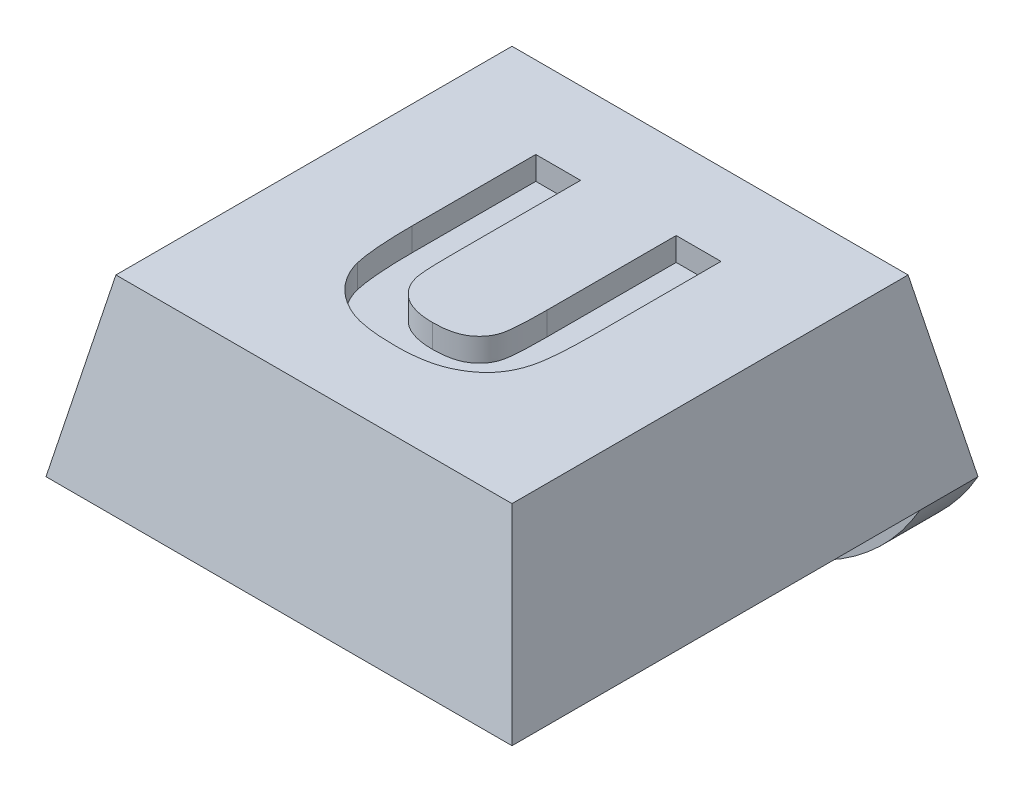
ISO-10303-21;
HEADER;
FILE_DESCRIPTION(('STEP AP214'),'2;1');
FILE_NAME('part.step','',(''),(''),'','','');
FILE_SCHEMA(('AUTOMOTIVE_DESIGN { 1 0 10303 214 1 1 1 1 }'));
ENDSEC;
DATA;
#1=APPLICATION_CONTEXT('core data for automotive mechanical design processes');
#2=APPLICATION_PROTOCOL_DEFINITION('international standard','automotive_design',2000,#1);
#3=PRODUCT_CONTEXT('',#1,'mechanical');
#4=PRODUCT('Part','Part','',(#3));
#5=PRODUCT_RELATED_PRODUCT_CATEGORY('part','',(#4));
#6=PRODUCT_DEFINITION_FORMATION('','',#4);
#7=PRODUCT_DEFINITION_CONTEXT('part definition',#1,'design');
#8=PRODUCT_DEFINITION('design','',#6,#7);
#9=PRODUCT_DEFINITION_SHAPE('','',#8);
#10=(LENGTH_UNIT() NAMED_UNIT(*) SI_UNIT(.MILLI.,.METRE.));
#11=(NAMED_UNIT(*) PLANE_ANGLE_UNIT() SI_UNIT($,.RADIAN.));
#12=(NAMED_UNIT(*) SI_UNIT($,.STERADIAN.) SOLID_ANGLE_UNIT());
#13=UNCERTAINTY_MEASURE_WITH_UNIT(LENGTH_MEASURE(1.E-05),#10,'distance_accuracy_value','');
#14=(GEOMETRIC_REPRESENTATION_CONTEXT(3) GLOBAL_UNCERTAINTY_ASSIGNED_CONTEXT((#13)) GLOBAL_UNIT_ASSIGNED_CONTEXT((#10,
#11,#12)) REPRESENTATION_CONTEXT('',''));
#15=CARTESIAN_POINT('',(0.,0.,0.));
#16=DIRECTION('',(0.,0.,1.));
#17=DIRECTION('',(1.,0.,0.));
#18=AXIS2_PLACEMENT_3D('',#15,#16,#17);
#19=CARTESIAN_POINT('',(0.,3.,0.));
#20=DIRECTION('',(0.,-1.,0.));
#21=DIRECTION('',(0.,0.,-1.));
#22=AXIS2_PLACEMENT_3D('',#19,#20,#21);
#23=PLANE('',#22);
#24=DIRECTION('',(-1.,0.,0.));
#25=VECTOR('',#24,1.);
#26=CARTESIAN_POINT('',(11.,3.,-0.6));
#27=LINE('',#26,#25);
#28=CARTESIAN_POINT('',(7.4,3.,-0.6));
#29=VERTEX_POINT('',#28);
#30=CARTESIAN_POINT('',(0.6,3.,-0.6));
#31=VERTEX_POINT('',#30);
#32=EDGE_CURVE('E229',#29,#31,#27,.T.);
#33=ORIENTED_EDGE('',*,*,#32,.F.);
#34=DIRECTION('',(0.,0.,1.));
#35=VECTOR('',#34,1.);
#36=CARTESIAN_POINT('',(7.4,3.,-8.));
#37=LINE('',#36,#35);
#38=CARTESIAN_POINT('',(7.4,3.,-7.4));
#39=VERTEX_POINT('',#38);
#40=EDGE_CURVE('E242',#39,#29,#37,.T.);
#41=ORIENTED_EDGE('',*,*,#40,.F.);
#42=DIRECTION('',(-1.,0.,0.));
#43=VECTOR('',#42,1.);
#44=CARTESIAN_POINT('',(11.,3.,-7.4));
#45=LINE('',#44,#43);
#46=CARTESIAN_POINT('',(0.599999999999999,3.,-7.4));
#47=VERTEX_POINT('',#46);
#48=EDGE_CURVE('E225',#39,#47,#45,.T.);
#49=ORIENTED_EDGE('',*,*,#48,.T.);
#50=DIRECTION('',(0.,0.,1.));
#51=VECTOR('',#50,1.);
#52=CARTESIAN_POINT('',(0.6,3.,-8.));
#53=LINE('',#52,#51);
#54=EDGE_CURVE('E245',#47,#31,#53,.T.);
#55=ORIENTED_EDGE('',*,*,#54,.T.);
#56=EDGE_LOOP('',(#33,#41,#49,#55));
#57=FACE_BOUND('',#56,.T.);
#58=DIRECTION('',(0.,0.,-1.));
#59=VECTOR('',#58,1.);
#60=CARTESIAN_POINT('',(2.41314026181107,3.,-3.87014547839466));
#61=LINE('',#60,#59);
#62=CARTESIAN_POINT('',(2.41314026181107,3.,-3.87014547839466));
#63=VERTEX_POINT('',#62);
#64=CARTESIAN_POINT('',(2.41314026181107,3.,-5.99514547839466));
#65=VERTEX_POINT('',#64);
#66=EDGE_CURVE('E58',#63,#65,#61,.T.);
#67=ORIENTED_EDGE('',*,*,#66,.T.);
#68=DIRECTION('',(1.,0.,0.));
#69=VECTOR('',#68,1.);
#70=CARTESIAN_POINT('',(2.41314026181107,3.,-5.99514547839466));
#71=LINE('',#70,#69);
#72=CARTESIAN_POINT('',(3.18237103104184,3.,-5.99514547839466));
#73=VERTEX_POINT('',#72);
#74=EDGE_CURVE('E197',#65,#73,#71,.T.);
#75=ORIENTED_EDGE('',*,*,#74,.T.);
#76=DIRECTION('',(0.,0.,1.));
#77=VECTOR('',#76,1.);
#78=CARTESIAN_POINT('',(3.18237103104184,3.,-5.99514547839466));
#79=LINE('',#78,#77);
#80=CARTESIAN_POINT('',(3.18237103104184,3.,-3.82447240147158));
#81=VERTEX_POINT('',#80);
#82=EDGE_CURVE('E695',#73,#81,#79,.T.);
#83=ORIENTED_EDGE('',*,*,#82,.T.);
#84=CARTESIAN_POINT('',(3.18237103104184,3.,-3.82447240147158));
#85=CARTESIAN_POINT('',(3.18266469492864,3.,-3.78333996841719));
#86=CARTESIAN_POINT('',(3.18322532716716,3.,-3.70481424885763));
#87=CARTESIAN_POINT('',(3.18361124176543,3.,-3.59262518044041));
#88=CARTESIAN_POINT('',(3.18574693972244,3.,-3.49189674937256));
#89=CARTESIAN_POINT('',(3.19037841056532,3.,-3.40246664659143));
#90=CARTESIAN_POINT('',(3.19355711693267,3.,-3.32438048014628));
#91=CARTESIAN_POINT('',(3.19945962920144,3.,-3.25762391832682));
#92=CARTESIAN_POINT('',(3.20534783647821,3.,-3.20222295906492));
#93=CARTESIAN_POINT('',(3.21107258842932,3.,-3.1692700104676));
#94=CARTESIAN_POINT('',(3.21362103104184,3.,-3.15460060659979));
#95=B_SPLINE_CURVE_WITH_KNOTS('',3,(#84,#85,#86,#87,#88,#89,#90,#91,#92,#93,#94),.UNSPECIFIED.,
.F.,.F.,(4,1,1,1,1,1,1,1,4),(0.,0.183825007060264,0.350939389686891,0.501381121480456,
0.634009924722662,0.75113916001217,0.85056330440193,0.933476446457445,1.),.UNSPECIFIED.);
#96=CARTESIAN_POINT('',(3.21362103104184,3.,-3.15460060659979));
#97=VERTEX_POINT('',#96);
#98=EDGE_CURVE('E690',#81,#97,#95,.T.);
#99=ORIENTED_EDGE('',*,*,#98,.T.);
#100=CARTESIAN_POINT('',(3.21362103104184,3.,-3.15460060659979));
#101=CARTESIAN_POINT('',(3.22412762778519,3.,-3.11505403752287));
#102=CARTESIAN_POINT('',(3.24481644323676,3.,-3.03718185023322));
#103=CARTESIAN_POINT('',(3.30184242677059,3.,-2.93073263742985));
#104=CARTESIAN_POINT('',(3.3771729457856,3.,-2.83690435982115));
#105=CARTESIAN_POINT('',(3.4540128524649,3.,-2.76998969413117));
#106=CARTESIAN_POINT('',(3.52352046730287,3.,-2.72263245904894));
#107=CARTESIAN_POINT('',(3.5825614906699,3.,-2.69381016306275));
#108=CARTESIAN_POINT('',(3.64520363108575,3.,-2.66753678693042));
#109=CARTESIAN_POINT('',(3.71277117624001,3.,-2.64737744766694));
#110=CARTESIAN_POINT('',(3.78453895067629,3.,-2.62973730085083));
#111=CARTESIAN_POINT('',(3.86137383334087,3.,-2.61953764416675));
#112=CARTESIAN_POINT('',(3.94262738294381,3.,-2.61170966141422));
#113=CARTESIAN_POINT('',(3.99832151695995,3.,-2.61093031444964));
#114=CARTESIAN_POINT('',(4.02692231309313,3.,-2.61053009377928));
#115=B_SPLINE_CURVE_WITH_KNOTS('',3,(#100,#101,#102,#103,#104,#105,#106,#107,#108,#109,#110,
#111,#112,#113,#114),.UNSPECIFIED.,.F.,.F.,(4,1,1,1,1,1,1,1,1,1,1,1,4),(0.,0.114743421271191,
0.225944282906219,0.336552611577656,0.451504771280934,0.511079547906043,0.572546352604732,
0.635866479310682,0.701907532163575,0.770586403165963,0.843449734748019,0.919606215265516,1.),.UNSPECIFIED.);
#116=CARTESIAN_POINT('',(4.02692231309313,3.,-2.61053009377928));
#117=VERTEX_POINT('',#116);
#118=EDGE_CURVE('E680',#97,#117,#115,.T.);
#119=ORIENTED_EDGE('',*,*,#118,.T.);
#120=CARTESIAN_POINT('',(4.02692231309313,3.,-2.61053009377928));
#121=CARTESIAN_POINT('',(4.05577738939585,3.,-2.61105343462313));
#122=CARTESIAN_POINT('',(4.11195763373269,3.,-2.61207236855943));
#123=CARTESIAN_POINT('',(4.19337239880035,3.,-2.618140475974));
#124=CARTESIAN_POINT('',(4.26933098261772,3.,-2.6295889026976));
#125=CARTESIAN_POINT('',(4.3397869186569,3.,-2.64460000101837));
#126=CARTESIAN_POINT('',(4.40511233006691,3.,-2.66357151356112));
#127=CARTESIAN_POINT('',(4.46478606122995,3.,-2.68759167847111));
#128=CARTESIAN_POINT('',(4.51871407488474,3.,-2.71649776940718));
#129=CARTESIAN_POINT('',(4.58207867780208,3.,-2.76006639104549));
#130=CARTESIAN_POINT('',(4.65025890781237,3.,-2.82152753804003));
#131=CARTESIAN_POINT('',(4.71587367402274,3.,-2.90509181849102));
#132=CARTESIAN_POINT('',(4.76283364949775,3.,-2.99733769361779));
#133=CARTESIAN_POINT('',(4.78485986819031,3.,-3.08156507740992));
#134=CARTESIAN_POINT('',(4.79618060478106,3.,-3.15494981075079));
#135=CARTESIAN_POINT('',(4.80307780638541,3.,-3.21916400061786));
#136=CARTESIAN_POINT('',(4.80938564586722,3.,-3.29183218243508));
#137=CARTESIAN_POINT('',(4.81511364662769,3.,-3.37275531916227));
#138=CARTESIAN_POINT('',(4.81903086457144,3.,-3.46199415311885));
#139=CARTESIAN_POINT('',(4.82114961918991,3.,-3.55977437520839));
#140=CARTESIAN_POINT('',(4.82281709018589,3.,-3.66608039145516));
#141=CARTESIAN_POINT('',(4.82319887283573,3.,-3.73980287784809));
#142=CARTESIAN_POINT('',(4.82339667206749,3.,-3.77799804249723));
#143=B_SPLINE_CURVE_WITH_KNOTS('',3,(#120,#121,#122,#123,#124,#125,#126,#127,#128,#129,#130,
#131,#132,#133,#134,#135,#136,#137,#138,#139,#140,#141,#142),.UNSPECIFIED.,.F.,.F.,(4,1,1,1,1,1,
1,1,1,1,1,1,1,1,1,1,1,1,1,1,4),(0.,0.0518438119306665,0.100938843171358,0.146542287812453,
0.189742133284701,0.230280246580349,0.268596217760667,0.30509323438548,0.33996418344798,
0.406554529976919,0.469135901134995,0.529866816686715,0.591101794550841,0.624629557038698,
0.663259733719709,0.707094516041552,0.755675646503373,0.808993028944534,0.86755245054543,
0.931379743056552,1.),.UNSPECIFIED.);
#144=CARTESIAN_POINT('',(4.82339667206749,3.,-3.77799804249723));
#145=VERTEX_POINT('',#144);
#146=EDGE_CURVE('E689',#117,#145,#143,.T.);
#147=ORIENTED_EDGE('',*,*,#146,.T.);
#148=DIRECTION('',(0.,0.,-1.));
#149=VECTOR('',#148,1.);
#150=CARTESIAN_POINT('',(4.82339667206749,3.,-3.77799804249723));
#151=LINE('',#150,#149);
#152=CARTESIAN_POINT('',(4.82339667206749,3.,-5.99514547839466));
#153=VERTEX_POINT('',#152);
#154=EDGE_CURVE('E716',#145,#153,#151,.T.);
#155=ORIENTED_EDGE('',*,*,#154,.T.);
#156=DIRECTION('',(1.,0.,0.));
#157=VECTOR('',#156,1.);
#158=CARTESIAN_POINT('',(4.82339667206749,3.,-5.99514547839466));
#159=LINE('',#158,#157);
#160=CARTESIAN_POINT('',(5.59262744129825,3.,-5.99514547839466));
#161=VERTEX_POINT('',#160);
#162=EDGE_CURVE('E723',#153,#161,#159,.T.);
#163=ORIENTED_EDGE('',*,*,#162,.T.);
#164=DIRECTION('',(0.,0.,1.));
#165=VECTOR('',#164,1.);
#166=CARTESIAN_POINT('',(5.59262744129825,3.,-5.99514547839466));
#167=LINE('',#166,#165);
#168=CARTESIAN_POINT('',(5.59262744129825,3.,-3.90299804249723));
#169=VERTEX_POINT('',#168);
#170=EDGE_CURVE('E727',#161,#169,#167,.T.);
#171=ORIENTED_EDGE('',*,*,#170,.T.);
#172=CARTESIAN_POINT('',(5.59262744129825,3.,-3.90299804249723));
#173=CARTESIAN_POINT('',(5.59252884740698,3.,-3.84530515735895));
#174=CARTESIAN_POINT('',(5.59233940195443,3.,-3.73444986407348));
#175=CARTESIAN_POINT('',(5.58938147465976,3.,-3.57495675504366));
#176=CARTESIAN_POINT('',(5.58309494056903,3.,-3.42862851389704));
#177=CARTESIAN_POINT('',(5.57783051076809,3.,-3.29521431202553));
#178=CARTESIAN_POINT('',(5.56767564210408,3.,-3.1750545028716));
#179=CARTESIAN_POINT('',(5.55704352929476,3.,-3.06807437577535));
#180=CARTESIAN_POINT('',(5.54334694702107,3.,-2.97429262707149));
#181=CARTESIAN_POINT('',(5.52381549319741,3.,-2.86769604126251));
#182=CARTESIAN_POINT('',(5.49099161499862,3.,-2.74810153051601));
#183=CARTESIAN_POINT('',(5.43809080901146,3.,-2.61599405575262));
#184=CARTESIAN_POINT('',(5.37048198877244,3.,-2.49580453247153));
#185=CARTESIAN_POINT('',(5.28843456199328,3.,-2.38707180572213));
#186=CARTESIAN_POINT('',(5.19242118774498,3.,-2.28936371421243));
#187=CARTESIAN_POINT('',(5.08100426899721,3.,-2.20306438137615));
#188=CARTESIAN_POINT('',(4.9553295008719,3.,-2.12712465052677));
#189=CARTESIAN_POINT('',(4.84016309009469,3.,-2.07244329887219));
#190=CARTESIAN_POINT('',(4.73975273479018,3.,-2.03562266860983));
#191=CARTESIAN_POINT('',(4.65797017955661,3.,-2.01070411598044));
#192=CARTESIAN_POINT('',(4.57044409312329,3.,-1.98995217493631));
#193=CARTESIAN_POINT('',(4.47727712811259,3.,-1.97348366403484));
#194=CARTESIAN_POINT('',(4.37842925153975,3.,-1.95959827304072));
#195=CARTESIAN_POINT('',(4.27386457386037,3.,-1.95032510694102));
#196=CARTESIAN_POINT('',(4.16374129146674,3.,-1.94453799725799));
#197=CARTESIAN_POINT('',(4.08862869941689,3.,-1.94409189838796));
#198=CARTESIAN_POINT('',(4.05015949258031,3.,-1.94386342711261));
#199=B_SPLINE_CURVE_WITH_KNOTS('',3,(#172,#173,#174,#175,#176,#177,#178,#179,#180,#181,#182,
#183,#184,#185,#186,#187,#188,#189,#190,#191,#192,#193,#194,#195,#196,#197,#198),.UNSPECIFIED.,
.F.,.F.,(4,1,1,1,1,1,1,1,1,1,1,1,1,1,1,1,1,1,1,1,1,1,1,1,4),(0.,0.0589822518665148,
0.113332776019573,0.163066996848931,0.208720820432053,0.249811139834418,0.286329176157329,
0.318613036661102,0.346676161329656,0.397089399385359,0.445108917572501,0.49181547303063,
0.537635583766378,0.583977529790645,0.631444968953473,0.681319919045405,0.733844646315688,
0.761490173539024,0.790600539422323,0.821199444835878,0.853389629847076,0.887295661622405,
0.923216688702173,0.960675127787456,1.),.UNSPECIFIED.);
#200=CARTESIAN_POINT('',(4.05015949258031,3.,-1.94386342711261));
#201=VERTEX_POINT('',#200);
#202=EDGE_CURVE('E731',#169,#201,#199,.T.);
#203=ORIENTED_EDGE('',*,*,#202,.T.);
#204=CARTESIAN_POINT('',(4.05015949258031,3.,-1.94386342711261));
#205=CARTESIAN_POINT('',(4.00394898952933,3.,-1.94445411740803));
#206=CARTESIAN_POINT('',(3.9144323565055,3.,-1.94559837256466));
#207=CARTESIAN_POINT('',(3.78449152160875,3.,-1.95070279676019));
#208=CARTESIAN_POINT('',(3.66341973054477,3.,-1.96123852335655));
#209=CARTESIAN_POINT('',(3.55083659828431,3.,-1.97547854435417));
#210=CARTESIAN_POINT('',(3.44678860813076,3.,-1.99378455697407));
#211=CARTESIAN_POINT('',(3.35101254315896,3.,-2.01566928059016));
#212=CARTESIAN_POINT('',(3.26427303539471,3.,-2.04332848315911));
#213=CARTESIAN_POINT('',(3.16095932069711,3.,-2.08283251168484));
#214=CARTESIAN_POINT('',(3.04579895158398,3.,-2.14326043214784));
#215=CARTESIAN_POINT('',(2.92044201771808,3.,-2.22387078646669));
#216=CARTESIAN_POINT('',(2.81040018703688,3.,-2.31485388374121));
#217=CARTESIAN_POINT('',(2.71664034282406,3.,-2.41532070508085));
#218=CARTESIAN_POINT('',(2.63826076225512,3.,-2.52174061827527));
#219=CARTESIAN_POINT('',(2.57455201153565,3.,-2.63181081387693));
#220=CARTESIAN_POINT('',(2.52349791577897,3.,-2.74369667159862));
#221=CARTESIAN_POINT('',(2.50216461629467,3.,-2.82145953251712));
#222=CARTESIAN_POINT('',(2.49166590283672,3.,-2.859728811728));
#223=B_SPLINE_CURVE_WITH_KNOTS('',3,(#204,#205,#206,#207,#208,#209,#210,#211,#212,#213,#214,
#215,#216,#217,#218,#219,#220,#221,#222),.UNSPECIFIED.,.F.,.F.,(4,1,1,1,1,1,1,1,1,1,1,1,1,1,1,1,
4),(0.,0.0705383458906597,0.136643291163387,0.198429902465619,0.25597418052394,
0.309794976232589,0.359633117755365,0.405792277216817,0.448642759284464,0.528318939757397,
0.603739881743586,0.675824581819638,0.745623938691081,0.812974235955689,0.877093332418524,
0.939514190668938,1.),.UNSPECIFIED.);
#224=CARTESIAN_POINT('',(2.49166590283672,3.,-2.859728811728));
#225=VERTEX_POINT('',#224);
#226=EDGE_CURVE('E737',#201,#225,#223,.T.);
#227=ORIENTED_EDGE('',*,*,#226,.T.);
#228=CARTESIAN_POINT('',(2.49166590283672,3.,-2.859728811728));
#229=CARTESIAN_POINT('',(2.48524032034861,3.,-2.88985779261521));
#230=CARTESIAN_POINT('',(2.4717059888718,3.,-2.95331906093462));
#231=CARTESIAN_POINT('',(2.4563347450899,3.,-3.05421003705364));
#232=CARTESIAN_POINT('',(2.44231164173273,3.,-3.16530789938682));
#233=CARTESIAN_POINT('',(2.43273367907065,3.,-3.28674405755191));
#234=CARTESIAN_POINT('',(2.42365464778243,3.,-3.41813321698583));
#235=CARTESIAN_POINT('',(2.41713622457908,3.,-3.55972311290971));
#236=CARTESIAN_POINT('',(2.41445584301621,3.,-3.71148159421584));
#237=CARTESIAN_POINT('',(2.41358762331959,3.,-3.81619205134908));
#238=CARTESIAN_POINT('',(2.41314026181107,3.,-3.87014547839466));
#239=B_SPLINE_CURVE_WITH_KNOTS('',3,(#228,#229,#230,#231,#232,#233,#234,#235,#236,#237,#238),
.UNSPECIFIED.,.F.,.F.,(4,1,1,1,1,1,1,1,4),(0.,0.0910089497500998,0.191693950790411,
0.301427787431465,0.421825191502953,0.55154595606244,0.690589809294285,0.840572368716177,1.),.UNSPECIFIED.);
#240=EDGE_CURVE('E193',#225,#63,#239,.T.);
#241=ORIENTED_EDGE('',*,*,#240,.T.);
#242=EDGE_LOOP('',(#67,#75,#83,#99,#119,#147,#155,#163,#171,#203,#227,#241));
#243=FACE_BOUND('',#242,.T.);
#244=ADVANCED_FACE('F42',(#57,#243),#23,.F.);
#245=CARTESIAN_POINT('',(8.,0.,-8.));
#246=DIRECTION('',(-0.98058067569092,-0.196116135138184,0.));
#247=DIRECTION('',(0.196116135138184,-0.98058067569092,0.));
#248=AXIS2_PLACEMENT_3D('',#245,#246,#247);
#249=PLANE('',#248);
#250=DIRECTION('',(-0.192450089729875,0.962250448649376,-0.192450089729875));
#251=VECTOR('',#250,1.);
#252=CARTESIAN_POINT('',(7.7037037037037,1.48148148148148,-0.296296296296296));
#253=LINE('',#252,#251);
#254=CARTESIAN_POINT('',(8.,0.,0.));
#255=VERTEX_POINT('',#254);
#256=EDGE_CURVE('E239',#255,#29,#253,.T.);
#257=ORIENTED_EDGE('',*,*,#256,.F.);
#258=DIRECTION('',(0.,0.,-1.));
#259=VECTOR('',#258,1.);
#260=CARTESIAN_POINT('',(8.,0.,0.));
#261=LINE('',#260,#259);
#262=CARTESIAN_POINT('',(8.,0.,-7.));
#263=VERTEX_POINT('',#262);
#264=EDGE_CURVE('E258',#255,#263,#261,.T.);
#265=ORIENTED_EDGE('',*,*,#264,.T.);
#266=DIRECTION('',(0.,0.,1.));
#267=VECTOR('',#266,1.);
#268=CARTESIAN_POINT('',(8.,0.,-8.));
#269=LINE('',#268,#267);
#270=CARTESIAN_POINT('',(8.,0.,-8.));
#271=VERTEX_POINT('',#270);
#272=EDGE_CURVE('E199',#271,#263,#269,.T.);
#273=ORIENTED_EDGE('',*,*,#272,.F.);
#274=DIRECTION('',(0.192450089729875,-0.962250448649376,-0.192450089729875));
#275=VECTOR('',#274,1.);
#276=CARTESIAN_POINT('',(8.,0.,-8.));
#277=LINE('',#276,#275);
#278=EDGE_CURVE('E232',#39,#271,#277,.T.);
#279=ORIENTED_EDGE('',*,*,#278,.F.);
#280=ORIENTED_EDGE('',*,*,#40,.T.);
#281=EDGE_LOOP('',(#257,#265,#273,#279,#280));
#282=FACE_BOUND('',#281,.T.);
#283=ADVANCED_FACE('F326',(#282),#249,.F.);
#284=CARTESIAN_POINT('',(0.,0.,-8.));
#285=DIRECTION('',(0.98058067569092,-0.196116135138184,0.));
#286=DIRECTION('',(0.196116135138184,0.98058067569092,0.));
#287=AXIS2_PLACEMENT_3D('',#284,#285,#286);
#288=PLANE('',#287);
#289=DIRECTION('',(-0.192450089729875,-0.962250448649376,0.192450089729875));
#290=VECTOR('',#289,1.);
#291=CARTESIAN_POINT('',(0.296296296296296,1.48148148148148,-0.296296296296296));
#292=LINE('',#291,#290);
#293=CARTESIAN_POINT('',(0.,0.,0.));
#294=VERTEX_POINT('',#293);
#295=EDGE_CURVE('E286',#31,#294,#292,.T.);
#296=ORIENTED_EDGE('',*,*,#295,.F.);
#297=ORIENTED_EDGE('',*,*,#54,.F.);
#298=DIRECTION('',(0.192450089729875,0.962250448649376,0.192450089729875));
#299=VECTOR('',#298,1.);
#300=CARTESIAN_POINT('',(0.,0.,-8.));
#301=LINE('',#300,#299);
#302=CARTESIAN_POINT('',(0.,0.,-8.));
#303=VERTEX_POINT('',#302);
#304=EDGE_CURVE('E257',#303,#47,#301,.T.);
#305=ORIENTED_EDGE('',*,*,#304,.F.);
#306=DIRECTION('',(0.,0.,1.));
#307=VECTOR('',#306,1.);
#308=CARTESIAN_POINT('',(0.,0.,0.));
#309=LINE('',#308,#307);
#310=CARTESIAN_POINT('',(0.,0.,-7.));
#311=VERTEX_POINT('',#310);
#312=EDGE_CURVE('E262',#303,#311,#309,.T.);
#313=ORIENTED_EDGE('',*,*,#312,.T.);
#314=EDGE_CURVE('E249',#311,#294,#309,.T.);
#315=ORIENTED_EDGE('',*,*,#314,.T.);
#316=EDGE_LOOP('',(#296,#297,#305,#313,#315));
#317=FACE_BOUND('',#316,.T.);
#318=ADVANCED_FACE('F310',(#317),#288,.F.);
#319=CARTESIAN_POINT('',(0.,0.,0.));
#320=DIRECTION('',(0.,-1.,0.));
#321=DIRECTION('',(0.,0.,-1.));
#322=AXIS2_PLACEMENT_3D('',#319,#320,#321);
#323=PLANE('',#322);
#324=DIRECTION('',(-1.,0.,0.));
#325=VECTOR('',#324,1.);
#326=CARTESIAN_POINT('',(0.,0.,-7.));
#327=LINE('',#326,#325);
#328=EDGE_CURVE('E205',#263,#311,#327,.T.);
#329=ORIENTED_EDGE('',*,*,#328,.F.);
#330=ORIENTED_EDGE('',*,*,#264,.F.);
#331=DIRECTION('',(1.,0.,0.));
#332=VECTOR('',#331,1.);
#333=CARTESIAN_POINT('',(0.,0.,0.));
#334=LINE('',#333,#332);
#335=EDGE_CURVE('E259',#294,#255,#334,.T.);
#336=ORIENTED_EDGE('',*,*,#335,.F.);
#337=ORIENTED_EDGE('',*,*,#314,.F.);
#338=EDGE_LOOP('',(#329,#330,#336,#337));
#339=FACE_BOUND('',#338,.T.);
#340=CARTESIAN_POINT('',(4.,0.,-3.75));
#341=DIRECTION('',(0.,-1.,0.));
#342=DIRECTION('',(0.,0.,-1.));
#343=AXIS2_PLACEMENT_3D('',#340,#341,#342);
#344=CIRCLE('',#343,1.8);
#345=CARTESIAN_POINT('',(4.,0.,-5.55));
#346=VERTEX_POINT('',#345);
#347=EDGE_CURVE('E217',#346,#346,#344,.T.);
#348=ORIENTED_EDGE('',*,*,#347,.F.);
#349=EDGE_LOOP('',(#348));
#350=FACE_BOUND('',#349,.T.);
#351=ADVANCED_FACE('F321',(#339,#350),#323,.T.);
#352=CARTESIAN_POINT('',(11.,3.,-7.4));
#353=DIRECTION('',(0.,0.196116135138184,-0.98058067569092));
#354=DIRECTION('',(0.,0.98058067569092,0.196116135138184));
#355=AXIS2_PLACEMENT_3D('',#352,#353,#354);
#356=PLANE('',#355);
#357=ORIENTED_EDGE('',*,*,#278,.T.);
#358=DIRECTION('',(-1.,0.,0.));
#359=VECTOR('',#358,1.);
#360=CARTESIAN_POINT('',(0.,0.,-8.));
#361=LINE('',#360,#359);
#362=EDGE_CURVE('E253',#271,#303,#361,.T.);
#363=ORIENTED_EDGE('',*,*,#362,.T.);
#364=ORIENTED_EDGE('',*,*,#304,.T.);
#365=ORIENTED_EDGE('',*,*,#48,.F.);
#366=EDGE_LOOP('',(#357,#363,#364,#365));
#367=FACE_BOUND('',#366,.T.);
#368=ADVANCED_FACE('F305',(#367),#356,.T.);
#369=CARTESIAN_POINT('',(11.,0.,0.));
#370=DIRECTION('',(0.,0.196116135138184,0.98058067569092));
#371=DIRECTION('',(0.,-0.98058067569092,0.196116135138184));
#372=AXIS2_PLACEMENT_3D('',#369,#370,#371);
#373=PLANE('',#372);
#374=ORIENTED_EDGE('',*,*,#256,.T.);
#375=ORIENTED_EDGE('',*,*,#32,.T.);
#376=ORIENTED_EDGE('',*,*,#295,.T.);
#377=ORIENTED_EDGE('',*,*,#335,.T.);
#378=EDGE_LOOP('',(#374,#375,#376,#377));
#379=FACE_BOUND('',#378,.T.);
#380=ADVANCED_FACE('F352',(#379),#373,.T.);
#381=CARTESIAN_POINT('',(4.,0.8,-3.75));
#382=DIRECTION('',(0.,-1.,0.));
#383=DIRECTION('',(0.,0.,-1.));
#384=AXIS2_PLACEMENT_3D('',#381,#382,#383);
#385=CYLINDRICAL_SURFACE('',#384,1.8);
#386=CARTESIAN_POINT('',(4.,0.8,-3.75));
#387=DIRECTION('',(0.,-1.,0.));
#388=DIRECTION('',(0.,0.,-1.));
#389=AXIS2_PLACEMENT_3D('',#386,#387,#388);
#390=CIRCLE('',#389,1.8);
#391=CARTESIAN_POINT('',(4.,0.8,-5.55));
#392=VERTEX_POINT('',#391);
#393=EDGE_CURVE('E221',#392,#392,#390,.T.);
#394=ORIENTED_EDGE('',*,*,#393,.F.);
#395=EDGE_LOOP('',(#394));
#396=FACE_BOUND('',#395,.T.);
#397=ORIENTED_EDGE('',*,*,#347,.T.);
#398=EDGE_LOOP('',(#397));
#399=FACE_BOUND('',#398,.T.);
#400=ADVANCED_FACE('F359',(#396,#399),#385,.F.);
#401=CARTESIAN_POINT('',(4.,0.8,-3.75));
#402=DIRECTION('',(0.,-1.,0.));
#403=DIRECTION('',(0.,0.,-1.));
#404=AXIS2_PLACEMENT_3D('',#401,#402,#403);
#405=PLANE('',#404);
#406=ORIENTED_EDGE('',*,*,#393,.T.);
#407=EDGE_LOOP('',(#406));
#408=FACE_BOUND('',#407,.T.);
#409=ADVANCED_FACE('F363',(#408),#405,.T.);
#410=CARTESIAN_POINT('',(0.,-2.,-8.));
#411=DIRECTION('',(0.,0.,1.));
#412=DIRECTION('',(1.,0.,0.));
#413=AXIS2_PLACEMENT_3D('',#410,#411,#412);
#414=PLANE('',#413);
#415=ORIENTED_EDGE('',*,*,#362,.F.);
#416=CARTESIAN_POINT('',(4.53589838486225,2.,-8.));
#417=DIRECTION('',(0.,0.,1.));
#418=DIRECTION('',(1.,0.,0.));
#419=AXIS2_PLACEMENT_3D('',#416,#417,#418);
#420=CIRCLE('',#419,4.);
#421=CARTESIAN_POINT('',(4.53589838486225,-2.,-8.));
#422=VERTEX_POINT('',#421);
#423=EDGE_CURVE('E11',#271,#422,#420,.F.);
#424=ORIENTED_EDGE('',*,*,#423,.T.);
#425=DIRECTION('',(1.,0.,0.));
#426=VECTOR('',#425,1.);
#427=CARTESIAN_POINT('',(0.,-2.,-8.));
#428=LINE('',#427,#426);
#429=CARTESIAN_POINT('',(3.46410161513775,-2.,-8.));
#430=VERTEX_POINT('',#429);
#431=EDGE_CURVE('E211',#430,#422,#428,.T.);
#432=ORIENTED_EDGE('',*,*,#431,.F.);
#433=CARTESIAN_POINT('',(3.46410161513775,2.,-8.));
#434=DIRECTION('',(0.,0.,1.));
#435=DIRECTION('',(1.,0.,0.));
#436=AXIS2_PLACEMENT_3D('',#433,#434,#435);
#437=CIRCLE('',#436,4.);
#438=EDGE_CURVE('E51',#430,#303,#437,.F.);
#439=ORIENTED_EDGE('',*,*,#438,.T.);
#440=EDGE_LOOP('',(#415,#424,#432,#439));
#441=FACE_BOUND('',#440,.T.);
#442=ADVANCED_FACE('F298',(#441),#414,.F.);
#443=CARTESIAN_POINT('',(0.,-2.,-7.));
#444=DIRECTION('',(0.,0.,-1.));
#445=DIRECTION('',(-1.,0.,0.));
#446=AXIS2_PLACEMENT_3D('',#443,#444,#445);
#447=PLANE('',#446);
#448=DIRECTION('',(-1.,0.,0.));
#449=VECTOR('',#448,1.);
#450=CARTESIAN_POINT('',(0.,-2.,-7.));
#451=LINE('',#450,#449);
#452=CARTESIAN_POINT('',(4.53589838486225,-2.,-7.));
#453=VERTEX_POINT('',#452);
#454=CARTESIAN_POINT('',(3.46410161513775,-2.,-7.));
#455=VERTEX_POINT('',#454);
#456=EDGE_CURVE('E215',#453,#455,#451,.T.);
#457=ORIENTED_EDGE('',*,*,#456,.F.);
#458=CARTESIAN_POINT('',(4.53589838486225,2.,-7.));
#459=DIRECTION('',(0.,0.,-1.));
#460=DIRECTION('',(-1.,0.,0.));
#461=AXIS2_PLACEMENT_3D('',#458,#459,#460);
#462=CIRCLE('',#461,4.);
#463=EDGE_CURVE('E292',#453,#263,#462,.F.);
#464=ORIENTED_EDGE('',*,*,#463,.T.);
#465=ORIENTED_EDGE('',*,*,#328,.T.);
#466=CARTESIAN_POINT('',(3.46410161513775,2.,-7.));
#467=DIRECTION('',(0.,0.,-1.));
#468=DIRECTION('',(-1.,0.,0.));
#469=AXIS2_PLACEMENT_3D('',#466,#467,#468);
#470=CIRCLE('',#469,4.);
#471=EDGE_CURVE('E66',#311,#455,#470,.F.);
#472=ORIENTED_EDGE('',*,*,#471,.T.);
#473=EDGE_LOOP('',(#457,#464,#465,#472));
#474=FACE_BOUND('',#473,.T.);
#475=ADVANCED_FACE('F316',(#474),#447,.F.);
#476=CARTESIAN_POINT('',(0.,-2.,0.));
#477=DIRECTION('',(0.,1.,0.));
#478=DIRECTION('',(0.,0.,1.));
#479=AXIS2_PLACEMENT_3D('',#476,#477,#478);
#480=PLANE('',#479);
#481=ORIENTED_EDGE('',*,*,#431,.T.);
#482=DIRECTION('',(0.,0.,1.));
#483=VECTOR('',#482,1.);
#484=CARTESIAN_POINT('',(4.53589838486225,-2.,0.));
#485=LINE('',#484,#483);
#486=EDGE_CURVE('E285',#422,#453,#485,.T.);
#487=ORIENTED_EDGE('',*,*,#486,.T.);
#488=ORIENTED_EDGE('',*,*,#456,.T.);
#489=DIRECTION('',(0.,0.,-1.));
#490=VECTOR('',#489,1.);
#491=CARTESIAN_POINT('',(3.46410161513775,-2.,0.));
#492=LINE('',#491,#490);
#493=EDGE_CURVE('E281',#455,#430,#492,.T.);
#494=ORIENTED_EDGE('',*,*,#493,.T.);
#495=EDGE_LOOP('',(#481,#487,#488,#494));
#496=FACE_BOUND('',#495,.T.);
#497=ADVANCED_FACE('F314',(#496),#480,.F.);
#498=CARTESIAN_POINT('',(4.53589838486225,2.,-8.));
#499=DIRECTION('',(0.,0.,1.));
#500=DIRECTION('',(1.,0.,0.));
#501=AXIS2_PLACEMENT_3D('',#498,#499,#500);
#502=CYLINDRICAL_SURFACE('',#501,4.);
#503=ORIENTED_EDGE('',*,*,#423,.F.);
#504=ORIENTED_EDGE('',*,*,#272,.T.);
#505=ORIENTED_EDGE('',*,*,#463,.F.);
#506=ORIENTED_EDGE('',*,*,#486,.F.);
#507=EDGE_LOOP('',(#503,#504,#505,#506));
#508=FACE_BOUND('',#507,.T.);
#509=ADVANCED_FACE('F327',(#508),#502,.T.);
#510=CARTESIAN_POINT('',(3.46410161513775,2.,-8.));
#511=DIRECTION('',(0.,0.,-1.));
#512=DIRECTION('',(-1.,0.,0.));
#513=AXIS2_PLACEMENT_3D('',#510,#511,#512);
#514=CYLINDRICAL_SURFACE('',#513,4.);
#515=ORIENTED_EDGE('',*,*,#471,.F.);
#516=ORIENTED_EDGE('',*,*,#312,.F.);
#517=ORIENTED_EDGE('',*,*,#438,.F.);
#518=ORIENTED_EDGE('',*,*,#493,.F.);
#519=EDGE_LOOP('',(#515,#516,#517,#518));
#520=FACE_BOUND('',#519,.T.);
#521=ADVANCED_FACE('F44',(#520),#514,.T.);
#522=CARTESIAN_POINT('',(2.41314026181107,2.6,-3.87014547839466));
#523=DIRECTION('',(1.,0.,0.));
#524=DIRECTION('',(0.,0.,-1.));
#525=AXIS2_PLACEMENT_3D('',#522,#523,#524);
#526=PLANE('',#525);
#527=ORIENTED_EDGE('',*,*,#66,.F.);
#528=DIRECTION('',(0.,1.,0.));
#529=VECTOR('',#528,1.);
#530=CARTESIAN_POINT('',(2.41314026181107,2.6,-3.87014547839466));
#531=LINE('',#530,#529);
#532=CARTESIAN_POINT('',(2.41314026181107,2.6,-3.87014547839466));
#533=VERTEX_POINT('',#532);
#534=EDGE_CURVE('E191',#533,#63,#531,.T.);
#535=ORIENTED_EDGE('',*,*,#534,.F.);
#536=DIRECTION('',(0.,0.,-1.));
#537=VECTOR('',#536,1.);
#538=CARTESIAN_POINT('',(2.41314026181107,2.6,-3.87014547839466));
#539=LINE('',#538,#537);
#540=CARTESIAN_POINT('',(2.41314026181107,2.6,-5.99514547839466));
#541=VERTEX_POINT('',#540);
#542=EDGE_CURVE('E181',#533,#541,#539,.T.);
#543=ORIENTED_EDGE('',*,*,#542,.T.);
#544=DIRECTION('',(0.,1.,0.));
#545=VECTOR('',#544,1.);
#546=CARTESIAN_POINT('',(2.41314026181107,2.6,-5.99514547839466));
#547=LINE('',#546,#545);
#548=EDGE_CURVE('E190',#541,#65,#547,.T.);
#549=ORIENTED_EDGE('',*,*,#548,.T.);
#550=EDGE_LOOP('',(#527,#535,#543,#549));
#551=FACE_BOUND('',#550,.T.);
#552=ADVANCED_FACE('F189',(#551),#526,.T.);
#553=CARTESIAN_POINT('',(2.41314026181107,2.6,-5.99514547839466));
#554=DIRECTION('',(0.,0.,1.));
#555=DIRECTION('',(1.,0.,0.));
#556=AXIS2_PLACEMENT_3D('',#553,#554,#555);
#557=PLANE('',#556);
#558=ORIENTED_EDGE('',*,*,#74,.F.);
#559=ORIENTED_EDGE('',*,*,#548,.F.);
#560=DIRECTION('',(1.,0.,0.));
#561=VECTOR('',#560,1.);
#562=CARTESIAN_POINT('',(2.41314026181107,2.6,-5.99514547839466));
#563=LINE('',#562,#561);
#564=CARTESIAN_POINT('',(3.18237103104184,2.6,-5.99514547839466));
#565=VERTEX_POINT('',#564);
#566=EDGE_CURVE('E177',#541,#565,#563,.T.);
#567=ORIENTED_EDGE('',*,*,#566,.T.);
#568=DIRECTION('',(0.,1.,0.));
#569=VECTOR('',#568,1.);
#570=CARTESIAN_POINT('',(3.18237103104184,2.6,-5.99514547839466));
#571=LINE('',#570,#569);
#572=EDGE_CURVE('E200',#565,#73,#571,.T.);
#573=ORIENTED_EDGE('',*,*,#572,.T.);
#574=EDGE_LOOP('',(#558,#559,#567,#573));
#575=FACE_BOUND('',#574,.T.);
#576=ADVANCED_FACE('F195',(#575),#557,.T.);
#577=CARTESIAN_POINT('',(3.18237103104184,2.6,-5.99514547839466));
#578=DIRECTION('',(-1.,0.,0.));
#579=DIRECTION('',(0.,0.,1.));
#580=AXIS2_PLACEMENT_3D('',#577,#578,#579);
#581=PLANE('',#580);
#582=ORIENTED_EDGE('',*,*,#82,.F.);
#583=ORIENTED_EDGE('',*,*,#572,.F.);
#584=DIRECTION('',(0.,0.,1.));
#585=VECTOR('',#584,1.);
#586=CARTESIAN_POINT('',(3.18237103104184,2.6,-5.99514547839466));
#587=LINE('',#586,#585);
#588=CARTESIAN_POINT('',(3.18237103104184,2.6,-3.82447240147158));
#589=VERTEX_POINT('',#588);
#590=EDGE_CURVE('E183',#565,#589,#587,.T.);
#591=ORIENTED_EDGE('',*,*,#590,.T.);
#592=DIRECTION('',(0.,1.,0.));
#593=VECTOR('',#592,1.);
#594=CARTESIAN_POINT('',(3.18237103104184,2.6,-3.82447240147158));
#595=LINE('',#594,#593);
#596=EDGE_CURVE('E207',#589,#81,#595,.T.);
#597=ORIENTED_EDGE('',*,*,#596,.T.);
#598=EDGE_LOOP('',(#582,#583,#591,#597));
#599=FACE_BOUND('',#598,.T.);
#600=ADVANCED_FACE('F376',(#599),#581,.T.);
#601=CARTESIAN_POINT('',(3.18237103104184,2.6,-3.82447240147158));
#602=CARTESIAN_POINT('',(3.18266469492864,2.6,-3.78333996841719));
#603=CARTESIAN_POINT('',(3.18322532716716,2.6,-3.70481424885763));
#604=CARTESIAN_POINT('',(3.18361124176543,2.6,-3.59262518044041));
#605=CARTESIAN_POINT('',(3.18574693972244,2.6,-3.49189674937256));
#606=CARTESIAN_POINT('',(3.19037841056532,2.6,-3.40246664659143));
#607=CARTESIAN_POINT('',(3.19355711693267,2.6,-3.32438048014628));
#608=CARTESIAN_POINT('',(3.19945962920144,2.6,-3.25762391832682));
#609=CARTESIAN_POINT('',(3.20534783647821,2.6,-3.20222295906492));
#610=CARTESIAN_POINT('',(3.21107258842932,2.6,-3.1692700104676));
#611=CARTESIAN_POINT('',(3.21362103104184,2.6,-3.15460060659979));
#612=B_SPLINE_CURVE_WITH_KNOTS('',3,(#601,#602,#603,#604,#605,#606,#607,#608,#609,#610,#611),
.UNSPECIFIED.,.F.,.F.,(4,1,1,1,1,1,1,1,4),(0.,0.183825007060264,0.350939389686891,
0.501381121480456,0.634009924722662,0.75113916001217,0.85056330440193,0.933476446457445,1.),.UNSPECIFIED.);
#613=DIRECTION('',(0.,1.,0.));
#614=VECTOR('',#613,1.);
#615=SURFACE_OF_LINEAR_EXTRUSION('',#612,#614);
#616=ORIENTED_EDGE('',*,*,#98,.F.);
#617=ORIENTED_EDGE('',*,*,#596,.F.);
#618=CARTESIAN_POINT('',(3.21362103104184,2.6,-3.15460060659979));
#619=VERTEX_POINT('',#618);
#620=EDGE_CURVE('E388',#589,#619,#612,.T.);
#621=ORIENTED_EDGE('',*,*,#620,.T.);
#622=DIRECTION('',(0.,1.,0.));
#623=VECTOR('',#622,1.);
#624=CARTESIAN_POINT('',(3.21362103104184,2.6,-3.15460060659979));
#625=LINE('',#624,#623);
#626=EDGE_CURVE('E682',#619,#97,#625,.T.);
#627=ORIENTED_EDGE('',*,*,#626,.T.);
#628=EDGE_LOOP('',(#616,#617,#621,#627));
#629=FACE_BOUND('',#628,.T.);
#630=ADVANCED_FACE('F379',(#629),#615,.T.);
#631=CARTESIAN_POINT('',(3.21362103104184,2.6,-3.15460060659979));
#632=CARTESIAN_POINT('',(3.22412762778519,2.6,-3.11505403752287));
#633=CARTESIAN_POINT('',(3.24481644323676,2.6,-3.03718185023322));
#634=CARTESIAN_POINT('',(3.30184242677059,2.6,-2.93073263742985));
#635=CARTESIAN_POINT('',(3.3771729457856,2.6,-2.83690435982115));
#636=CARTESIAN_POINT('',(3.4540128524649,2.6,-2.76998969413117));
#637=CARTESIAN_POINT('',(3.52352046730287,2.6,-2.72263245904894));
#638=CARTESIAN_POINT('',(3.5825614906699,2.6,-2.69381016306275));
#639=CARTESIAN_POINT('',(3.64520363108575,2.6,-2.66753678693042));
#640=CARTESIAN_POINT('',(3.71277117624001,2.6,-2.64737744766694));
#641=CARTESIAN_POINT('',(3.78453895067629,2.6,-2.62973730085083));
#642=CARTESIAN_POINT('',(3.86137383334087,2.6,-2.61953764416675));
#643=CARTESIAN_POINT('',(3.94262738294381,2.6,-2.61170966141422));
#644=CARTESIAN_POINT('',(3.99832151695995,2.6,-2.61093031444964));
#645=CARTESIAN_POINT('',(4.02692231309313,2.6,-2.61053009377928));
#646=B_SPLINE_CURVE_WITH_KNOTS('',3,(#631,#632,#633,#634,#635,#636,#637,#638,#639,#640,#641,
#642,#643,#644,#645),.UNSPECIFIED.,.F.,.F.,(4,1,1,1,1,1,1,1,1,1,1,1,4),(0.,0.114743421271191,
0.225944282906219,0.336552611577656,0.451504771280934,0.511079547906043,0.572546352604732,
0.635866479310682,0.701907532163575,0.770586403165963,0.843449734748019,0.919606215265516,1.),.UNSPECIFIED.);
#647=DIRECTION('',(0.,1.,0.));
#648=VECTOR('',#647,1.);
#649=SURFACE_OF_LINEAR_EXTRUSION('',#646,#648);
#650=ORIENTED_EDGE('',*,*,#118,.F.);
#651=ORIENTED_EDGE('',*,*,#626,.F.);
#652=CARTESIAN_POINT('',(4.02692231309313,2.6,-2.61053009377928));
#653=VERTEX_POINT('',#652);
#654=EDGE_CURVE('E394',#619,#653,#646,.T.);
#655=ORIENTED_EDGE('',*,*,#654,.T.);
#656=DIRECTION('',(0.,1.,0.));
#657=VECTOR('',#656,1.);
#658=CARTESIAN_POINT('',(4.02692231309313,2.6,-2.61053009377928));
#659=LINE('',#658,#657);
#660=EDGE_CURVE('E685',#653,#117,#659,.T.);
#661=ORIENTED_EDGE('',*,*,#660,.T.);
#662=EDGE_LOOP('',(#650,#651,#655,#661));
#663=FACE_BOUND('',#662,.T.);
#664=ADVANCED_FACE('F384',(#663),#649,.T.);
#665=CARTESIAN_POINT('',(4.02692231309313,2.6,-2.61053009377928));
#666=CARTESIAN_POINT('',(4.05577738939585,2.6,-2.61105343462313));
#667=CARTESIAN_POINT('',(4.11195763373269,2.6,-2.61207236855943));
#668=CARTESIAN_POINT('',(4.19337239880035,2.6,-2.618140475974));
#669=CARTESIAN_POINT('',(4.26933098261772,2.6,-2.6295889026976));
#670=CARTESIAN_POINT('',(4.3397869186569,2.6,-2.64460000101837));
#671=CARTESIAN_POINT('',(4.40511233006691,2.6,-2.66357151356112));
#672=CARTESIAN_POINT('',(4.46478606122995,2.6,-2.68759167847111));
#673=CARTESIAN_POINT('',(4.51871407488474,2.6,-2.71649776940718));
#674=CARTESIAN_POINT('',(4.58207867780208,2.6,-2.76006639104549));
#675=CARTESIAN_POINT('',(4.65025890781237,2.6,-2.82152753804003));
#676=CARTESIAN_POINT('',(4.71587367402274,2.6,-2.90509181849102));
#677=CARTESIAN_POINT('',(4.76283364949775,2.6,-2.99733769361779));
#678=CARTESIAN_POINT('',(4.78485986819031,2.6,-3.08156507740992));
#679=CARTESIAN_POINT('',(4.79618060478106,2.6,-3.15494981075079));
#680=CARTESIAN_POINT('',(4.80307780638541,2.6,-3.21916400061786));
#681=CARTESIAN_POINT('',(4.80938564586722,2.6,-3.29183218243508));
#682=CARTESIAN_POINT('',(4.81511364662769,2.6,-3.37275531916227));
#683=CARTESIAN_POINT('',(4.81903086457144,2.6,-3.46199415311885));
#684=CARTESIAN_POINT('',(4.82114961918991,2.6,-3.55977437520839));
#685=CARTESIAN_POINT('',(4.82281709018589,2.6,-3.66608039145516));
#686=CARTESIAN_POINT('',(4.82319887283573,2.6,-3.73980287784809));
#687=CARTESIAN_POINT('',(4.82339667206749,2.6,-3.77799804249723));
#688=B_SPLINE_CURVE_WITH_KNOTS('',3,(#665,#666,#667,#668,#669,#670,#671,#672,#673,#674,#675,
#676,#677,#678,#679,#680,#681,#682,#683,#684,#685,#686,#687),.UNSPECIFIED.,.F.,.F.,(4,1,1,1,1,1,
1,1,1,1,1,1,1,1,1,1,1,1,1,1,4),(0.,0.0518438119306665,0.100938843171358,0.146542287812453,
0.189742133284701,0.230280246580349,0.268596217760667,0.30509323438548,0.33996418344798,
0.406554529976919,0.469135901134995,0.529866816686715,0.591101794550841,0.624629557038698,
0.663259733719709,0.707094516041552,0.755675646503373,0.808993028944534,0.86755245054543,
0.931379743056552,1.),.UNSPECIFIED.);
#689=DIRECTION('',(0.,1.,0.));
#690=VECTOR('',#689,1.);
#691=SURFACE_OF_LINEAR_EXTRUSION('',#688,#690);
#692=ORIENTED_EDGE('',*,*,#146,.F.);
#693=ORIENTED_EDGE('',*,*,#660,.F.);
#694=CARTESIAN_POINT('',(4.82339667206749,2.6,-3.77799804249723));
#695=VERTEX_POINT('',#694);
#696=EDGE_CURVE('E403',#653,#695,#688,.T.);
#697=ORIENTED_EDGE('',*,*,#696,.T.);
#698=DIRECTION('',(0.,1.,0.));
#699=VECTOR('',#698,1.);
#700=CARTESIAN_POINT('',(4.82339667206749,2.6,-3.77799804249723));
#701=LINE('',#700,#699);
#702=EDGE_CURVE('E774',#695,#145,#701,.T.);
#703=ORIENTED_EDGE('',*,*,#702,.T.);
#704=EDGE_LOOP('',(#692,#693,#697,#703));
#705=FACE_BOUND('',#704,.T.);
#706=ADVANCED_FACE('F417',(#705),#691,.T.);
#707=CARTESIAN_POINT('',(4.82339667206749,2.6,-3.77799804249723));
#708=DIRECTION('',(1.,0.,0.));
#709=DIRECTION('',(0.,0.,-1.));
#710=AXIS2_PLACEMENT_3D('',#707,#708,#709);
#711=PLANE('',#710);
#712=ORIENTED_EDGE('',*,*,#154,.F.);
#713=ORIENTED_EDGE('',*,*,#702,.F.);
#714=DIRECTION('',(0.,0.,-1.));
#715=VECTOR('',#714,1.);
#716=CARTESIAN_POINT('',(4.82339667206749,2.6,-3.77799804249723));
#717=LINE('',#716,#715);
#718=CARTESIAN_POINT('',(4.82339667206749,2.6,-5.99514547839466));
#719=VERTEX_POINT('',#718);
#720=EDGE_CURVE('E412',#695,#719,#717,.T.);
#721=ORIENTED_EDGE('',*,*,#720,.T.);
#722=DIRECTION('',(0.,1.,0.));
#723=VECTOR('',#722,1.);
#724=CARTESIAN_POINT('',(4.82339667206749,2.6,-5.99514547839466));
#725=LINE('',#724,#723);
#726=EDGE_CURVE('E771',#719,#153,#725,.T.);
#727=ORIENTED_EDGE('',*,*,#726,.T.);
#728=EDGE_LOOP('',(#712,#713,#721,#727));
#729=FACE_BOUND('',#728,.T.);
#730=ADVANCED_FACE('F420',(#729),#711,.T.);
#731=CARTESIAN_POINT('',(4.82339667206749,2.6,-5.99514547839466));
#732=DIRECTION('',(0.,0.,1.));
#733=DIRECTION('',(1.,0.,0.));
#734=AXIS2_PLACEMENT_3D('',#731,#732,#733);
#735=PLANE('',#734);
#736=ORIENTED_EDGE('',*,*,#162,.F.);
#737=ORIENTED_EDGE('',*,*,#726,.F.);
#738=DIRECTION('',(1.,0.,0.));
#739=VECTOR('',#738,1.);
#740=CARTESIAN_POINT('',(4.82339667206749,2.6,-5.99514547839466));
#741=LINE('',#740,#739);
#742=CARTESIAN_POINT('',(5.59262744129825,2.6,-5.99514547839466));
#743=VERTEX_POINT('',#742);
#744=EDGE_CURVE('E790',#719,#743,#741,.T.);
#745=ORIENTED_EDGE('',*,*,#744,.T.);
#746=DIRECTION('',(0.,1.,0.));
#747=VECTOR('',#746,1.);
#748=CARTESIAN_POINT('',(5.59262744129825,2.6,-5.99514547839466));
#749=LINE('',#748,#747);
#750=EDGE_CURVE('E768',#743,#161,#749,.T.);
#751=ORIENTED_EDGE('',*,*,#750,.T.);
#752=EDGE_LOOP('',(#736,#737,#745,#751));
#753=FACE_BOUND('',#752,.T.);
#754=ADVANCED_FACE('F424',(#753),#735,.T.);
#755=CARTESIAN_POINT('',(5.59262744129825,2.6,-5.99514547839466));
#756=DIRECTION('',(-1.,0.,0.));
#757=DIRECTION('',(0.,0.,1.));
#758=AXIS2_PLACEMENT_3D('',#755,#756,#757);
#759=PLANE('',#758);
#760=ORIENTED_EDGE('',*,*,#170,.F.);
#761=ORIENTED_EDGE('',*,*,#750,.F.);
#762=DIRECTION('',(0.,0.,1.));
#763=VECTOR('',#762,1.);
#764=CARTESIAN_POINT('',(5.59262744129825,2.6,-5.99514547839466));
#765=LINE('',#764,#763);
#766=CARTESIAN_POINT('',(5.59262744129825,2.6,-3.90299804249723));
#767=VERTEX_POINT('',#766);
#768=EDGE_CURVE('E448',#743,#767,#765,.T.);
#769=ORIENTED_EDGE('',*,*,#768,.T.);
#770=DIRECTION('',(0.,1.,0.));
#771=VECTOR('',#770,1.);
#772=CARTESIAN_POINT('',(5.59262744129825,2.6,-3.90299804249723));
#773=LINE('',#772,#771);
#774=EDGE_CURVE('E765',#767,#169,#773,.T.);
#775=ORIENTED_EDGE('',*,*,#774,.T.);
#776=EDGE_LOOP('',(#760,#761,#769,#775));
#777=FACE_BOUND('',#776,.T.);
#778=ADVANCED_FACE('F428',(#777),#759,.T.);
#779=CARTESIAN_POINT('',(5.59262744129825,2.6,-3.90299804249723));
#780=CARTESIAN_POINT('',(5.59252884740698,2.6,-3.84530515735895));
#781=CARTESIAN_POINT('',(5.59233940195443,2.6,-3.73444986407348));
#782=CARTESIAN_POINT('',(5.58938147465976,2.6,-3.57495675504366));
#783=CARTESIAN_POINT('',(5.58309494056903,2.6,-3.42862851389704));
#784=CARTESIAN_POINT('',(5.57783051076809,2.6,-3.29521431202553));
#785=CARTESIAN_POINT('',(5.56767564210408,2.6,-3.1750545028716));
#786=CARTESIAN_POINT('',(5.55704352929476,2.6,-3.06807437577535));
#787=CARTESIAN_POINT('',(5.54334694702107,2.6,-2.97429262707149));
#788=CARTESIAN_POINT('',(5.52381549319741,2.6,-2.86769604126251));
#789=CARTESIAN_POINT('',(5.49099161499862,2.6,-2.74810153051601));
#790=CARTESIAN_POINT('',(5.43809080901146,2.6,-2.61599405575262));
#791=CARTESIAN_POINT('',(5.37048198877244,2.6,-2.49580453247153));
#792=CARTESIAN_POINT('',(5.28843456199328,2.6,-2.38707180572213));
#793=CARTESIAN_POINT('',(5.19242118774498,2.6,-2.28936371421243));
#794=CARTESIAN_POINT('',(5.08100426899721,2.6,-2.20306438137615));
#795=CARTESIAN_POINT('',(4.9553295008719,2.6,-2.12712465052677));
#796=CARTESIAN_POINT('',(4.84016309009469,2.6,-2.07244329887219));
#797=CARTESIAN_POINT('',(4.73975273479018,2.6,-2.03562266860983));
#798=CARTESIAN_POINT('',(4.65797017955661,2.6,-2.01070411598044));
#799=CARTESIAN_POINT('',(4.57044409312329,2.6,-1.98995217493631));
#800=CARTESIAN_POINT('',(4.47727712811259,2.6,-1.97348366403484));
#801=CARTESIAN_POINT('',(4.37842925153975,2.6,-1.95959827304072));
#802=CARTESIAN_POINT('',(4.27386457386037,2.6,-1.95032510694102));
#803=CARTESIAN_POINT('',(4.16374129146674,2.6,-1.94453799725799));
#804=CARTESIAN_POINT('',(4.08862869941689,2.6,-1.94409189838796));
#805=CARTESIAN_POINT('',(4.05015949258031,2.6,-1.94386342711261));
#806=B_SPLINE_CURVE_WITH_KNOTS('',3,(#779,#780,#781,#782,#783,#784,#785,#786,#787,#788,#789,
#790,#791,#792,#793,#794,#795,#796,#797,#798,#799,#800,#801,#802,#803,#804,#805),.UNSPECIFIED.,
.F.,.F.,(4,1,1,1,1,1,1,1,1,1,1,1,1,1,1,1,1,1,1,1,1,1,1,1,4),(0.,0.0589822518665148,
0.113332776019573,0.163066996848931,0.208720820432053,0.249811139834418,0.286329176157329,
0.318613036661102,0.346676161329656,0.397089399385359,0.445108917572501,0.49181547303063,
0.537635583766378,0.583977529790645,0.631444968953473,0.681319919045405,0.733844646315688,
0.761490173539024,0.790600539422323,0.821199444835878,0.853389629847076,0.887295661622405,
0.923216688702173,0.960675127787456,1.),.UNSPECIFIED.);
#807=DIRECTION('',(0.,1.,0.));
#808=VECTOR('',#807,1.);
#809=SURFACE_OF_LINEAR_EXTRUSION('',#806,#808);
#810=ORIENTED_EDGE('',*,*,#202,.F.);
#811=ORIENTED_EDGE('',*,*,#774,.F.);
#812=CARTESIAN_POINT('',(4.05015949258031,2.6,-1.94386342711261));
#813=VERTEX_POINT('',#812);
#814=EDGE_CURVE('E441',#767,#813,#806,.T.);
#815=ORIENTED_EDGE('',*,*,#814,.T.);
#816=DIRECTION('',(0.,1.,0.));
#817=VECTOR('',#816,1.);
#818=CARTESIAN_POINT('',(4.05015949258031,2.6,-1.94386342711261));
#819=LINE('',#818,#817);
#820=EDGE_CURVE('E762',#813,#201,#819,.T.);
#821=ORIENTED_EDGE('',*,*,#820,.T.);
#822=EDGE_LOOP('',(#810,#811,#815,#821));
#823=FACE_BOUND('',#822,.T.);
#824=ADVANCED_FACE('F432',(#823),#809,.T.);
#825=CARTESIAN_POINT('',(4.05015949258031,2.6,-1.94386342711261));
#826=CARTESIAN_POINT('',(4.00394898952933,2.6,-1.94445411740803));
#827=CARTESIAN_POINT('',(3.9144323565055,2.6,-1.94559837256466));
#828=CARTESIAN_POINT('',(3.78449152160875,2.6,-1.95070279676019));
#829=CARTESIAN_POINT('',(3.66341973054477,2.6,-1.96123852335655));
#830=CARTESIAN_POINT('',(3.55083659828431,2.6,-1.97547854435417));
#831=CARTESIAN_POINT('',(3.44678860813076,2.6,-1.99378455697407));
#832=CARTESIAN_POINT('',(3.35101254315896,2.6,-2.01566928059016));
#833=CARTESIAN_POINT('',(3.26427303539471,2.6,-2.04332848315911));
#834=CARTESIAN_POINT('',(3.16095932069711,2.6,-2.08283251168484));
#835=CARTESIAN_POINT('',(3.04579895158398,2.6,-2.14326043214784));
#836=CARTESIAN_POINT('',(2.92044201771808,2.6,-2.22387078646669));
#837=CARTESIAN_POINT('',(2.81040018703688,2.6,-2.31485388374121));
#838=CARTESIAN_POINT('',(2.71664034282406,2.6,-2.41532070508085));
#839=CARTESIAN_POINT('',(2.63826076225512,2.6,-2.52174061827527));
#840=CARTESIAN_POINT('',(2.57455201153565,2.6,-2.63181081387693));
#841=CARTESIAN_POINT('',(2.52349791577897,2.6,-2.74369667159862));
#842=CARTESIAN_POINT('',(2.50216461629467,2.6,-2.82145953251712));
#843=CARTESIAN_POINT('',(2.49166590283672,2.6,-2.859728811728));
#844=B_SPLINE_CURVE_WITH_KNOTS('',3,(#825,#826,#827,#828,#829,#830,#831,#832,#833,#834,#835,
#836,#837,#838,#839,#840,#841,#842,#843),.UNSPECIFIED.,.F.,.F.,(4,1,1,1,1,1,1,1,1,1,1,1,1,1,1,1,
4),(0.,0.0705383458906597,0.136643291163387,0.198429902465619,0.25597418052394,
0.309794976232589,0.359633117755365,0.405792277216817,0.448642759284464,0.528318939757397,
0.603739881743586,0.675824581819638,0.745623938691081,0.812974235955689,0.877093332418524,
0.939514190668938,1.),.UNSPECIFIED.);
#845=DIRECTION('',(0.,1.,0.));
#846=VECTOR('',#845,1.);
#847=SURFACE_OF_LINEAR_EXTRUSION('',#844,#846);
#848=ORIENTED_EDGE('',*,*,#226,.F.);
#849=ORIENTED_EDGE('',*,*,#820,.F.);
#850=CARTESIAN_POINT('',(2.49166590283672,2.6,-2.859728811728));
#851=VERTEX_POINT('',#850);
#852=EDGE_CURVE('E447',#813,#851,#844,.T.);
#853=ORIENTED_EDGE('',*,*,#852,.T.);
#854=DIRECTION('',(0.,1.,0.));
#855=VECTOR('',#854,1.);
#856=CARTESIAN_POINT('',(2.49166590283672,2.6,-2.859728811728));
#857=LINE('',#856,#855);
#858=EDGE_CURVE('E759',#851,#225,#857,.T.);
#859=ORIENTED_EDGE('',*,*,#858,.T.);
#860=EDGE_LOOP('',(#848,#849,#853,#859));
#861=FACE_BOUND('',#860,.T.);
#862=ADVANCED_FACE('F437',(#861),#847,.T.);
#863=CARTESIAN_POINT('',(2.49166590283672,2.6,-2.859728811728));
#864=CARTESIAN_POINT('',(2.48524032034861,2.6,-2.88985779261521));
#865=CARTESIAN_POINT('',(2.4717059888718,2.6,-2.95331906093462));
#866=CARTESIAN_POINT('',(2.4563347450899,2.6,-3.05421003705364));
#867=CARTESIAN_POINT('',(2.44231164173273,2.6,-3.16530789938682));
#868=CARTESIAN_POINT('',(2.43273367907065,2.6,-3.28674405755191));
#869=CARTESIAN_POINT('',(2.42365464778243,2.6,-3.41813321698583));
#870=CARTESIAN_POINT('',(2.41713622457908,2.6,-3.55972311290971));
#871=CARTESIAN_POINT('',(2.41445584301621,2.6,-3.71148159421584));
#872=CARTESIAN_POINT('',(2.41358762331959,2.6,-3.81619205134908));
#873=CARTESIAN_POINT('',(2.41314026181107,2.6,-3.87014547839466));
#874=B_SPLINE_CURVE_WITH_KNOTS('',3,(#863,#864,#865,#866,#867,#868,#869,#870,#871,#872,#873),
.UNSPECIFIED.,.F.,.F.,(4,1,1,1,1,1,1,1,4),(0.,0.0910089497500998,0.191693950790411,
0.301427787431465,0.421825191502953,0.55154595606244,0.690589809294285,0.840572368716177,1.),.UNSPECIFIED.);
#875=DIRECTION('',(0.,1.,0.));
#876=VECTOR('',#875,1.);
#877=SURFACE_OF_LINEAR_EXTRUSION('',#874,#876);
#878=ORIENTED_EDGE('',*,*,#240,.F.);
#879=ORIENTED_EDGE('',*,*,#858,.F.);
#880=EDGE_CURVE('E457',#851,#533,#874,.T.);
#881=ORIENTED_EDGE('',*,*,#880,.T.);
#882=ORIENTED_EDGE('',*,*,#534,.T.);
#883=EDGE_LOOP('',(#878,#879,#881,#882));
#884=FACE_BOUND('',#883,.T.);
#885=ADVANCED_FACE('F470',(#884),#877,.T.);
#886=CARTESIAN_POINT('',(3.18634288537522,2.6,-3.48886039101394));
#887=DIRECTION('',(6.93440550873238E-12,1.,0.));
#888=DIRECTION('',(-1.,6.93440550873238E-12,0.));
#889=AXIS2_PLACEMENT_3D('',#886,#887,#888);
#890=PLANE('',#889);
#891=ORIENTED_EDGE('',*,*,#542,.F.);
#892=ORIENTED_EDGE('',*,*,#880,.F.);
#893=ORIENTED_EDGE('',*,*,#852,.F.);
#894=ORIENTED_EDGE('',*,*,#814,.F.);
#895=ORIENTED_EDGE('',*,*,#768,.F.);
#896=ORIENTED_EDGE('',*,*,#744,.F.);
#897=ORIENTED_EDGE('',*,*,#720,.F.);
#898=ORIENTED_EDGE('',*,*,#696,.F.);
#899=ORIENTED_EDGE('',*,*,#654,.F.);
#900=ORIENTED_EDGE('',*,*,#620,.F.);
#901=ORIENTED_EDGE('',*,*,#590,.F.);
#902=ORIENTED_EDGE('',*,*,#566,.F.);
#903=EDGE_LOOP('',(#891,#892,#893,#894,#895,#896,#897,#898,#899,#900,#901,#902));
#904=FACE_BOUND('',#903,.T.);
#905=ADVANCED_FACE('F179',(#904),#890,.T.);
#906=CLOSED_SHELL('',(#244,#283,#318,#351,#368,#380,#400,#409,#442,#475,#497,#509,#521,#552,
#576,#600,#630,#664,#706,#730,#754,#778,#824,#862,#885,#905));
#907=MANIFOLD_SOLID_BREP('B2',#906);
#908=ADVANCED_BREP_SHAPE_REPRESENTATION('',(#18,#907),#14);
#909=SHAPE_DEFINITION_REPRESENTATION(#9,#908);
ENDSEC;
END-ISO-10303-21;
